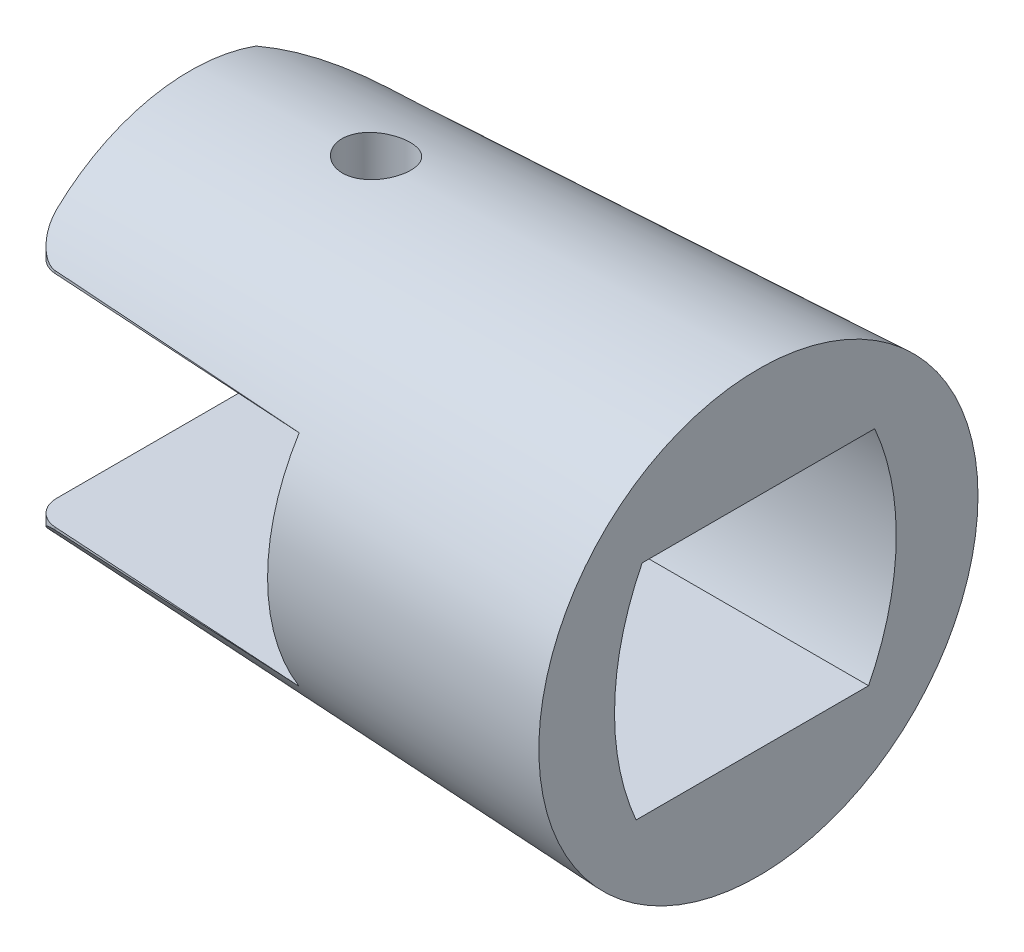
ISO-10303-21;
HEADER;
FILE_DESCRIPTION(('STEP AP214'),'2;1');
FILE_NAME('part.step','',(''),(''),'','','');
FILE_SCHEMA(('AUTOMOTIVE_DESIGN { 1 0 10303 214 1 1 1 1 }'));
ENDSEC;
DATA;
#1=APPLICATION_CONTEXT('core data for automotive mechanical design processes');
#2=APPLICATION_PROTOCOL_DEFINITION('international standard','automotive_design',2000,#1);
#3=PRODUCT_CONTEXT('',#1,'mechanical');
#4=PRODUCT('Part','Part','',(#3));
#5=PRODUCT_RELATED_PRODUCT_CATEGORY('part','',(#4));
#6=PRODUCT_DEFINITION_FORMATION('','',#4);
#7=PRODUCT_DEFINITION_CONTEXT('part definition',#1,'design');
#8=PRODUCT_DEFINITION('design','',#6,#7);
#9=PRODUCT_DEFINITION_SHAPE('','',#8);
#10=(LENGTH_UNIT() NAMED_UNIT(*) SI_UNIT(.MILLI.,.METRE.));
#11=(NAMED_UNIT(*) PLANE_ANGLE_UNIT() SI_UNIT($,.RADIAN.));
#12=(NAMED_UNIT(*) SI_UNIT($,.STERADIAN.) SOLID_ANGLE_UNIT());
#13=UNCERTAINTY_MEASURE_WITH_UNIT(LENGTH_MEASURE(1.E-05),#10,'distance_accuracy_value','');
#14=(GEOMETRIC_REPRESENTATION_CONTEXT(3) GLOBAL_UNCERTAINTY_ASSIGNED_CONTEXT((#13)) GLOBAL_UNIT_ASSIGNED_CONTEXT((#10,
#11,#12)) REPRESENTATION_CONTEXT('',''));
#15=CARTESIAN_POINT('',(0.,0.,0.));
#16=DIRECTION('',(0.,0.,1.));
#17=DIRECTION('',(1.,0.,0.));
#18=AXIS2_PLACEMENT_3D('',#15,#16,#17);
#19=CARTESIAN_POINT('',(-11.,0.,10.));
#20=DIRECTION('',(1.,0.,0.));
#21=DIRECTION('',(0.,0.,-1.));
#22=AXIS2_PLACEMENT_3D('',#19,#20,#21);
#23=PLANE('',#22);
#24=DIRECTION('',(0.,0.,-1.));
#25=VECTOR('',#24,1.);
#26=CARTESIAN_POINT('',(-11.,4.25,10.));
#27=LINE('',#26,#25);
#28=CARTESIAN_POINT('',(-11.,4.25,6.77772085586298));
#29=VERTEX_POINT('',#28);
#30=CARTESIAN_POINT('',(-11.,4.25,4.5));
#31=VERTEX_POINT('',#30);
#32=EDGE_CURVE('E247',#29,#31,#27,.T.);
#33=ORIENTED_EDGE('',*,*,#32,.T.);
#34=CARTESIAN_POINT('',(-11.,-0.249999999999947,-4.43028554974591));
#35=DIRECTION('',(1.,0.,0.));
#36=DIRECTION('',(0.,0.,-1.));
#37=AXIS2_PLACEMENT_3D('',#34,#35,#36);
#38=CIRCLE('',#37,10.);
#39=CARTESIAN_POINT('',(-11.,-4.25,4.73486584016575));
#40=VERTEX_POINT('',#39);
#41=EDGE_CURVE('E371',#31,#40,#38,.T.);
#42=ORIENTED_EDGE('',*,*,#41,.T.);
#43=DIRECTION('',(0.,0.,-1.));
#44=VECTOR('',#43,1.);
#45=CARTESIAN_POINT('',(-11.,-4.25,10.));
#46=LINE('',#45,#44);
#47=CARTESIAN_POINT('',(-11.,-4.25,6.77772085586298));
#48=VERTEX_POINT('',#47);
#49=EDGE_CURVE('E251',#48,#40,#46,.T.);
#50=ORIENTED_EDGE('',*,*,#49,.F.);
#51=CARTESIAN_POINT('',(-11.,0.,0.));
#52=DIRECTION('',(1.,0.,0.));
#53=DIRECTION('',(0.,0.,-1.));
#54=AXIS2_PLACEMENT_3D('',#51,#52,#53);
#55=CIRCLE('',#54,8.);
#56=EDGE_CURVE('E437',#48,#29,#55,.F.);
#57=ORIENTED_EDGE('',*,*,#56,.T.);
#58=EDGE_LOOP('',(#33,#42,#50,#57));
#59=FACE_BOUND('',#58,.T.);
#60=ADVANCED_FACE('F44',(#59),#23,.F.);
#61=CARTESIAN_POINT('',(-22.,0.,0.));
#62=DIRECTION('',(1.,0.,0.));
#63=DIRECTION('',(0.,0.,-1.));
#64=AXIS2_PLACEMENT_3D('',#61,#62,#63);
#65=CONICAL_SURFACE('',#64,7.5,0.0454232794215771);
#66=CARTESIAN_POINT('',(-16.1991105064426,7.64213239860376,-1.36838948473856));
#67=CARTESIAN_POINT('',(-16.1508958141531,7.63542076172434,-1.41830655928894));
#68=CARTESIAN_POINT('',(-16.0984640394933,7.62911627347668,-1.46425428633825));
#69=CARTESIAN_POINT('',(-15.9865616989317,7.61798266028014,-1.54688930956662));
#70=CARTESIAN_POINT('',(-15.9270857940176,7.6131546644773,-1.58356951471042));
#71=CARTESIAN_POINT('',(-15.802712395997,7.60556121739957,-1.64657757660265));
#72=CARTESIAN_POINT('',(-15.7378122849934,7.60279676852596,-1.6729003991531));
#73=CARTESIAN_POINT('',(-15.6044894198699,7.59976966951342,-1.71435496620886));
#74=CARTESIAN_POINT('',(-15.5360675880329,7.59950636768161,-1.72948962492742));
#75=CARTESIAN_POINT('',(-15.3986493193805,7.601678960494,-1.74800214952895));
#76=CARTESIAN_POINT('',(-15.3296735239488,7.60407800564145,-1.75153790545443));
#77=CARTESIAN_POINT('',(-15.1922197490342,7.61147677366023,-1.74724166449967));
#78=CARTESIAN_POINT('',(-15.1237417778008,7.61647653952937,-1.73940947966908));
#79=CARTESIAN_POINT('',(-14.9893122034088,7.62878729562398,-1.71270870352584));
#80=CARTESIAN_POINT('',(-14.9233566968642,7.63609453825562,-1.69385796559172));
#81=CARTESIAN_POINT('',(-14.7956032365479,7.65254635393307,-1.64575063446263));
#82=CARTESIAN_POINT('',(-14.7338057780463,7.66169114533623,-1.61649280426639));
#83=CARTESIAN_POINT('',(-14.6146164208518,7.68142115811766,-1.54765952743847));
#84=CARTESIAN_POINT('',(-14.5573538680598,7.69203400686407,-1.50786808141507));
#85=CARTESIAN_POINT('',(-14.4502759218419,7.71379780513905,-1.41939866566641));
#86=CARTESIAN_POINT('',(-14.4004616008841,7.72494883185447,-1.37071941842715));
#87=CARTESIAN_POINT('',(-14.308562494205,7.74727150917654,-1.26458252042323));
#88=CARTESIAN_POINT('',(-14.266672691938,7.75843817733606,-1.2069547552206));
#89=CARTESIAN_POINT('',(-14.1932084656516,7.7797615741078,-1.08528800075841));
#90=CARTESIAN_POINT('',(-14.1616339806865,7.78991830868673,-1.02124904938079));
#91=CARTESIAN_POINT('',(-14.1098588735166,7.80851391292312,-0.888725966160254));
#92=CARTESIAN_POINT('',(-14.0896222542327,7.81695816450501,-0.820256681647045));
#93=CARTESIAN_POINT('',(-14.061072971363,7.83165138460125,-0.680648621468626));
#94=CARTESIAN_POINT('',(-14.052758507449,7.83790068446094,-0.609510250519243));
#95=CARTESIAN_POINT('',(-14.0484522952261,7.84778514931267,-0.468304544460963));
#96=CARTESIAN_POINT('',(-14.0521855342659,7.85147635133582,-0.398249476364143));
#97=CARTESIAN_POINT('',(-14.071329170513,7.85640983357746,-0.259667810323408));
#98=CARTESIAN_POINT('',(-14.0867385243256,7.85765233257991,-0.191141076368558));
#99=CARTESIAN_POINT('',(-14.128492897101,7.85785284225483,-0.058605743907525));
#100=CARTESIAN_POINT('',(-14.1546754138614,7.85684385409155,0.00545411413245929));
#101=CARTESIAN_POINT('',(-14.2172061762014,7.8529554420828,0.128339672817716));
#102=CARTESIAN_POINT('',(-14.2535547688558,7.85007595437311,0.187165194669775));
#103=CARTESIAN_POINT('',(-14.33564939293,7.84290661884702,0.298331454790711));
#104=CARTESIAN_POINT('',(-14.3814541520736,7.83860785145139,0.35062822183059));
#105=CARTESIAN_POINT('',(-14.4810394588978,7.82917620282735,0.446889941699957));
#106=CARTESIAN_POINT('',(-14.5348206521234,7.82404325408415,0.490854219511729));
#107=CARTESIAN_POINT('',(-14.6496931312128,7.81345670361802,0.569825204161493));
#108=CARTESIAN_POINT('',(-14.7108758925215,7.80799962872127,0.604698457611458));
#109=CARTESIAN_POINT('',(-14.8382444432748,7.79739564393625,0.6637044897007));
#110=CARTESIAN_POINT('',(-14.9044303303778,7.79224874010588,0.687837058623818));
#111=CARTESIAN_POINT('',(-15.0402241368509,7.78270476049587,0.72473880536946));
#112=CARTESIAN_POINT('',(-15.1098440907648,7.77831060474813,0.737464507047952));
#113=CARTESIAN_POINT('',(-15.2502912846662,7.77060175559334,0.751001880492983));
#114=CARTESIAN_POINT('',(-15.3211184785031,7.767287021019,0.751814006675144));
#115=CARTESIAN_POINT('',(-15.4615301135133,7.76186641491048,0.741504998097269));
#116=CARTESIAN_POINT('',(-15.5311193880888,7.75975362099767,0.730453277969864));
#117=CARTESIAN_POINT('',(-15.6674801831399,7.75662221504508,0.696824735222845));
#118=CARTESIAN_POINT('',(-15.7342517323173,7.75560359185731,0.674248030029435));
#119=CARTESIAN_POINT('',(-15.8628851054713,7.75439899973845,0.618287283442594));
#120=CARTESIAN_POINT('',(-15.9247600998771,7.75421071707963,0.584933551104948));
#121=CARTESIAN_POINT('',(-16.0420578125317,7.75426433037923,0.508343495615129));
#122=CARTESIAN_POINT('',(-16.0974803849768,7.7545062360565,0.465106949208793));
#123=CARTESIAN_POINT('',(-16.2004511088615,7.75494768906834,0.369839556377424));
#124=CARTESIAN_POINT('',(-16.2479773370052,7.75514711889195,0.317785010074491));
#125=CARTESIAN_POINT('',(-16.33362259248,7.75501450579899,0.206439946900698));
#126=CARTESIAN_POINT('',(-16.3717416868938,7.75468246667248,0.147149481634012));
#127=CARTESIAN_POINT('',(-16.437483487879,7.75305536372848,0.0230317553152771));
#128=CARTESIAN_POINT('',(-16.4651077721284,7.7517604447467,-0.0417946717232883));
#129=CARTESIAN_POINT('',(-16.5090837599272,7.74789483036569,-0.175125147731818));
#130=CARTESIAN_POINT('',(-16.5254361602932,7.74532421384571,-0.243628969086713));
#131=CARTESIAN_POINT('',(-16.5463860889201,7.73877397471131,-0.38207858523554));
#132=CARTESIAN_POINT('',(-16.5510276678073,7.73479969655463,-0.452017975678318));
#133=CARTESIAN_POINT('',(-16.5485915654112,7.72548754817343,-0.59161330924282));
#134=CARTESIAN_POINT('',(-16.5415116273113,7.72014941552488,-0.661269195191051));
#135=CARTESIAN_POINT('',(-16.5158437856867,7.70833750676838,-0.798518169432213));
#136=CARTESIAN_POINT('',(-16.4972245671329,7.70186067486092,-0.866105117574989));
#137=CARTESIAN_POINT('',(-16.4490137309468,7.68820545400156,-0.997124780343338));
#138=CARTESIAN_POINT('',(-16.4194307611689,7.68102762125416,-1.06056072287359));
#139=CARTESIAN_POINT('',(-16.3591222362737,7.66840925157617,-1.16590935920253));
#140=CARTESIAN_POINT('',(-16.3306707233596,7.66299948879188,-1.20914558818589));
#141=CARTESIAN_POINT('',(-16.2686303426236,7.65236191060591,-1.29178587179423));
#142=CARTESIAN_POINT('',(-16.2350414332522,7.64713409667618,-1.33118989542148));
#143=CARTESIAN_POINT('',(-16.1991105064426,7.64213239860376,-1.36838948473856));
#144=B_SPLINE_CURVE_WITH_KNOTS('',3,(#66,#67,#68,#69,#70,#71,#72,#73,#74,#75,#76,#77,#78,#79,
#80,#81,#82,#83,#84,#85,#86,#87,#88,#89,#90,#91,#92,#93,#94,#95,#96,#97,#98,#99,#100,#101,#102,
#103,#104,#105,#106,#107,#108,#109,#110,#111,#112,#113,#114,#115,#116,#117,#118,#119,#120,#121,
#122,#123,#124,#125,#126,#127,#128,#129,#130,#131,#132,#133,#134,#135,#136,#137,#138,#139,#140,
#141,#142,#143),.UNSPECIFIED.,.T.,.F.,(4,2,2,2,2,2,2,2,2,2,2,2,2,2,2,2,2,2,2,2,2,2,2,2,2,2,2,2,
2,2,2,2,2,2,2,2,2,2,4),(0.,0.20898815908834,0.41813574427288,0.627384860280111,
0.836579453344756,1.04291430318027,1.24925256446439,1.45525741870395,1.66128676715023,
1.87192122846896,2.08258598981495,2.29790285538215,2.51321844877551,2.72784649621161,
2.94244212990628,3.15217414289225,3.36188741612846,3.56854703875268,3.77521371769965,
3.98320475141169,4.19121262735113,4.40212098182154,4.61303345418124,4.82474642188118,
5.03645131426148,5.24692425172714,5.45739504476097,5.66727899295867,5.87716768293301,
6.08762970444704,6.29809022510347,6.50851909483774,6.71893495490389,6.92855814100928,
7.13822169186476,7.3484567293843,7.55852629197703,7.71426880857834,7.87001258483612),.UNSPECIFIED.);
#145=CARTESIAN_POINT('',(-16.1991105064426,7.64213239860376,-1.36838948473856));
#146=VERTEX_POINT('',#145);
#147=EDGE_CURVE('E181',#146,#146,#144,.T.);
#148=ORIENTED_EDGE('',*,*,#147,.T.);
#149=EDGE_LOOP('',(#148));
#150=FACE_BOUND('',#149,.T.);
#151=CARTESIAN_POINT('',(-41.5118530495364,0.,4.90960169713127));
#152=DIRECTION('',(-0.0611115794993297,0.,0.998130940734279));
#153=DIRECTION('',(0.998130940734279,0.,0.0611115794993297));
#154=AXIS2_PLACEMENT_3D('',#151,#152,#153);
#155=ELLIPSE('',#154,108.213494771976,4.43044815934391);
#156=CARTESIAN_POINT('',(-21.0611115794994,-4.35030922266395,6.16171909191617));
#157=VERTEX_POINT('',#156);
#158=EDGE_CURVE('E412',#48,#157,#155,.F.);
#159=ORIENTED_EDGE('',*,*,#158,.T.);
#160=CARTESIAN_POINT('',(-21.0611115794993,-4.35030922266395,6.16171909191617));
#161=CARTESIAN_POINT('',(-21.0960747914109,-4.35051356340758,6.15962202294587));
#162=CARTESIAN_POINT('',(-21.1307813214346,-4.35346778045731,6.15561243833207));
#163=CARTESIAN_POINT('',(-21.1985190771024,-4.36415418241963,6.14426807244674));
#164=CARTESIAN_POINT('',(-21.2315642056245,-4.3718351604082,6.13696914977953));
#165=CARTESIAN_POINT('',(-21.3035295203859,-4.39369648239994,6.11731554569819));
#166=CARTESIAN_POINT('',(-21.3418761871241,-4.40901577852048,6.10415620522647));
#167=CARTESIAN_POINT('',(-21.4149283606298,-4.44443557078691,6.07430260660561));
#168=CARTESIAN_POINT('',(-21.4496163023613,-4.46455774127447,6.05759236262458));
#169=CARTESIAN_POINT('',(-21.531946468789,-4.51931086063731,6.01225519576181));
#170=CARTESIAN_POINT('',(-21.5771775571261,-4.55610872004904,5.98189606961668));
#171=CARTESIAN_POINT('',(-21.6598615980811,-4.6342222492668,5.91681901434334));
#172=CARTESIAN_POINT('',(-21.6972980555852,-4.67554722314516,5.88209208602675));
#173=CARTESIAN_POINT('',(-21.7830311966419,-4.78319627199736,5.79019145424798));
#174=CARTESIAN_POINT('',(-21.8267397409008,-4.85127319447803,5.73079069632704));
#175=CARTESIAN_POINT('',(-21.8996051814965,-4.98975683289049,5.60620400269983));
#176=CARTESIAN_POINT('',(-21.9287525468712,-5.06016504269773,5.54101431065619));
#177=CARTESIAN_POINT('',(-21.9669423984771,-5.18258484226127,5.42388394775105));
#178=CARTESIAN_POINT('',(-21.9792550755708,-5.2345697331447,5.37296218184321));
#179=CARTESIAN_POINT('',(-21.9957467088538,-5.33772131710358,5.26944127270405));
#180=CARTESIAN_POINT('',(-21.9999586548459,-5.38889048351514,5.2168498232289));
#181=CARTESIAN_POINT('',(-21.9999999999995,-5.43942713814805,5.16358716482823));
#182=B_SPLINE_CURVE_WITH_KNOTS('',3,(#160,#161,#162,#163,#164,#165,#166,#167,#168,#169,#170,
#171,#172,#173,#174,#175,#176,#177,#178,#179,#180,#181),.UNSPECIFIED.,.F.,.F.,(4,2,2,2,2,2,2,2,
2,2,4),(0.,0.104737956290573,0.20836074561613,0.337663511366164,0.467561208549421,
0.663680584398123,0.860210864778958,1.15972124568397,1.45942741390104,1.68039223758089,
1.90045527217779),.UNSPECIFIED.);
#183=CARTESIAN_POINT('',(-22.,-5.43942765765587,5.16358765802045));
#184=VERTEX_POINT('',#183);
#185=EDGE_CURVE('E302',#157,#184,#182,.T.);
#186=ORIENTED_EDGE('',*,*,#185,.T.);
#187=CARTESIAN_POINT('',(-22.,0.,0.));
#188=DIRECTION('',(1.,0.,0.));
#189=DIRECTION('',(0.,0.,-1.));
#190=AXIS2_PLACEMENT_3D('',#187,#188,#189);
#191=CIRCLE('',#190,7.5);
#192=CARTESIAN_POINT('',(-21.9999999999998,-7.05225000259581,-2.55260061523294));
#193=VERTEX_POINT('',#192);
#194=EDGE_CURVE('E266',#184,#193,#191,.T.);
#195=ORIENTED_EDGE('',*,*,#194,.T.);
#196=CARTESIAN_POINT('',(-16.5272227634073,-3.91896344353208,-6.684687530857));
#197=CARTESIAN_POINT('',(-16.6427127671059,-3.95329674635129,-6.65847955556438));
#198=CARTESIAN_POINT('',(-16.7566693164258,-3.99085174347405,-6.63004153669327));
#199=CARTESIAN_POINT('',(-16.9814370959532,-4.07124785328741,-6.56895905885342));
#200=CARTESIAN_POINT('',(-17.0922510678245,-4.11408417226116,-6.53631841332278));
#201=CARTESIAN_POINT('',(-17.3105332665758,-4.20381588665415,-6.46714088297935));
#202=CARTESIAN_POINT('',(-17.4180105859096,-4.25069863463741,-6.43061606093192));
#203=CARTESIAN_POINT('',(-17.6301048386284,-4.34772844122679,-6.35373913994798));
#204=CARTESIAN_POINT('',(-17.7347210411814,-4.39787632300832,-6.31338607468899));
#205=CARTESIAN_POINT('',(-18.0447644315248,-4.5521525011536,-6.18664455827059));
#206=CARTESIAN_POINT('',(-18.2460892693231,-4.65998636071397,-6.09466885439665));
#207=CARTESIAN_POINT('',(-18.6388142973702,-4.88064755111759,-5.89629879498852));
#208=CARTESIAN_POINT('',(-18.8302055665367,-4.99347920742176,-5.78989177859903));
#209=CARTESIAN_POINT('',(-19.2013077328751,-5.21918797308576,-5.56413300492337));
#210=CARTESIAN_POINT('',(-19.3811286353753,-5.33204927424095,-5.4449462930683));
#211=CARTESIAN_POINT('',(-19.7315405271321,-5.5563305825324,-5.19258525325173));
#212=CARTESIAN_POINT('',(-19.902133820893,-5.66775094419051,-5.05941444234583));
#213=CARTESIAN_POINT('',(-20.2334519196861,-5.88654777947444,-4.77921817415432));
#214=CARTESIAN_POINT('',(-20.3941996852896,-5.99393341697105,-4.63222714993483));
#215=CARTESIAN_POINT('',(-20.7055597270612,-6.20270444576696,-4.32401521420343));
#216=CARTESIAN_POINT('',(-20.8561739450322,-6.30409098616918,-4.16279704268034));
#217=CARTESIAN_POINT('',(-21.1878961239379,-6.52657567812968,-3.77774033897472));
#218=CARTESIAN_POINT('',(-21.3653992935145,-6.64501396174254,-3.54918276892559));
#219=CARTESIAN_POINT('',(-21.6995216755857,-6.86375180811079,-3.06823085541814));
#220=CARTESIAN_POINT('',(-21.8560787946518,-6.96399774059342,-2.81576926932262));
#221=CARTESIAN_POINT('',(-22.0003080623877,-7.0524389734962,-2.55203732001921));
#222=B_SPLINE_CURVE_WITH_KNOTS('',3,(#196,#197,#198,#199,#200,#201,#202,#203,#204,#205,#206,
#207,#208,#209,#210,#211,#212,#213,#214,#215,#216,#217,#218,#219,#220,#221),.UNSPECIFIED.,.F.,
.F.,(4,2,2,2,2,2,2,2,2,2,2,2,4),(0.,0.369742220096412,0.739151272096876,1.10744485071781,
1.47583164236118,2.21361214682884,2.95204415797171,3.68188313790468,4.41153899812975,
5.13942280519199,5.86716673466465,6.80312857828965,7.74180629803889),.UNSPECIFIED.);
#223=CARTESIAN_POINT('',(-17.4146827218211,-4.25,-6.43096361755301));
#224=VERTEX_POINT('',#223);
#225=EDGE_CURVE('E239',#224,#193,#222,.T.);
#226=ORIENTED_EDGE('',*,*,#225,.F.);
#227=CARTESIAN_POINT('',(-33.8126852718489,-4.25,-5.5155871153025));
#228=CARTESIAN_POINT('',(-31.3853699075223,-4.25,-5.65483903287506));
#229=CARTESIAN_POINT('',(-28.957947196194,-4.25,-5.79220398289213));
#230=CARTESIAN_POINT('',(-24.102926214611,-4.25,-6.06376035771553));
#231=CARTESIAN_POINT('',(-21.6753279445077,-4.25,-6.1979517852292));
#232=CARTESIAN_POINT('',(-16.8199914715129,-4.25,-6.46376172585246));
#233=CARTESIAN_POINT('',(-14.392253268658,-4.25,-6.59538023963274));
#234=CARTESIAN_POINT('',(-9.53665959490313,-4.25,-6.85645963504762));
#235=CARTESIAN_POINT('',(-7.10880412393918,-4.25,-6.98592051549281));
#236=CARTESIAN_POINT('',(-1.41358013309213,-4.25,-7.28746835630175));
#237=CARTESIAN_POINT('',(1.85382742252967,-4.25,-7.45881773024276));
#238=CARTESIAN_POINT('',(8.38878193375573,-4.25,-7.79884413360508));
#239=CARTESIAN_POINT('',(11.6563288893827,-4.25,-7.96752116258884));
#240=CARTESIAN_POINT('',(18.1915294937373,-4.25,-8.3026724390855));
#241=CARTESIAN_POINT('',(21.4591831422524,-4.25,-8.46914669074715));
#242=CARTESIAN_POINT('',(27.9945834199728,-4.25,-8.80023650372375));
#243=CARTESIAN_POINT('',(31.2623300491432,-4.25,-8.96485206572805));
#244=CARTESIAN_POINT('',(34.5301144470347,-4.25,-9.1287102280395));
#245=B_SPLINE_CURVE_WITH_KNOTS('',3,(#227,#228,#229,#230,#231,#232,#233,#234,#235,#236,#237,
#238,#239,#240,#241,#242,#243,#244),.UNSPECIFIED.,.F.,.F.,(4,2,2,2,2,2,2,2,4),(0.,
7.29391725989147,14.5878282970991,21.8817374329576,29.1756505895328,38.9913414305139,
48.8070338786212,58.6227078370245,68.438378154867),.UNSPECIFIED.);
#246=CARTESIAN_POINT('',(-11.,-4.25,-6.77772085586298));
#247=VERTEX_POINT('',#246);
#248=EDGE_CURVE('E321',#224,#247,#245,.T.);
#249=ORIENTED_EDGE('',*,*,#248,.T.);
#250=CARTESIAN_POINT('',(-11.,4.25,-6.77772085586298));
#251=VERTEX_POINT('',#250);
#252=EDGE_CURVE('E326',#251,#247,#55,.F.);
#253=ORIENTED_EDGE('',*,*,#252,.F.);
#254=CARTESIAN_POINT('',(-33.8126852718489,4.25,-5.5155871153025));
#255=CARTESIAN_POINT('',(-31.3853699075223,4.25,-5.65483903287507));
#256=CARTESIAN_POINT('',(-28.957947196194,4.25,-5.79220398289214));
#257=CARTESIAN_POINT('',(-24.102926214611,4.25,-6.06376035771554));
#258=CARTESIAN_POINT('',(-21.6753279445077,4.25,-6.19795178522921));
#259=CARTESIAN_POINT('',(-16.8199914715129,4.25,-6.46376172585246));
#260=CARTESIAN_POINT('',(-14.392253268658,4.25,-6.59538023963274));
#261=CARTESIAN_POINT('',(-9.53665959490313,4.25,-6.85645963504762));
#262=CARTESIAN_POINT('',(-7.10880412393918,4.25,-6.98592051549281));
#263=CARTESIAN_POINT('',(-1.41358013309214,4.25,-7.28746835630175));
#264=CARTESIAN_POINT('',(1.85382742252966,4.25,-7.45881773024276));
#265=CARTESIAN_POINT('',(8.38878193375571,4.25,-7.79884413360508));
#266=CARTESIAN_POINT('',(11.6563288893827,4.25,-7.96752116258884));
#267=CARTESIAN_POINT('',(18.1915294937373,4.25,-8.3026724390855));
#268=CARTESIAN_POINT('',(21.4591831422524,4.25,-8.46914669074715));
#269=CARTESIAN_POINT('',(27.9945834199728,4.25,-8.80023650372375));
#270=CARTESIAN_POINT('',(31.2623300491432,4.25,-8.96485206572805));
#271=CARTESIAN_POINT('',(34.5301144470347,4.25,-9.1287102280395));
#272=B_SPLINE_CURVE_WITH_KNOTS('',3,(#254,#255,#256,#257,#258,#259,#260,#261,#262,#263,#264,
#265,#266,#267,#268,#269,#270,#271),.UNSPECIFIED.,.F.,.F.,(4,2,2,2,2,2,2,2,4),(0.,
7.29391725989147,14.5878282970991,21.8817374329576,29.1756505895328,38.9913414305139,
48.8070338786212,58.6227078370245,68.438378154867),.UNSPECIFIED.);
#273=CARTESIAN_POINT('',(-17.4146827218211,4.25,-6.43096361755301));
#274=VERTEX_POINT('',#273);
#275=EDGE_CURVE('E436',#251,#274,#272,.F.);
#276=ORIENTED_EDGE('',*,*,#275,.T.);
#277=CARTESIAN_POINT('',(-22.0003080623877,7.0524389734962,-2.55203732001921));
#278=CARTESIAN_POINT('',(-21.8865501625451,6.98266926908595,-2.76006889586726));
#279=CARTESIAN_POINT('',(-21.7650667699985,6.90553513148157,-2.96115407159308));
#280=CARTESIAN_POINT('',(-21.508493529345,6.73917648584937,-3.34864268637224));
#281=CARTESIAN_POINT('',(-21.3734265500854,6.64997221400663,-3.53506989034863));
#282=CARTESIAN_POINT('',(-21.0914944642558,6.4620983081212,-3.8926999624019));
#283=CARTESIAN_POINT('',(-20.9446595735615,6.36345279678775,-4.0639395844802));
#284=CARTESIAN_POINT('',(-20.6400538581137,6.15879267743817,-4.39176817948242));
#285=CARTESIAN_POINT('',(-20.4822783291448,6.05277489946614,-4.54835078138103));
#286=CARTESIAN_POINT('',(-20.1578370784349,5.83643149189731,-4.84588988896659));
#287=CARTESIAN_POINT('',(-19.9912387897799,5.72613989346029,-4.98694502527183));
#288=CARTESIAN_POINT('',(-19.6486850111953,5.50289121690271,-5.25481733215771));
#289=CARTESIAN_POINT('',(-19.4727300721882,5.38993429593453,-5.38163533965996));
#290=CARTESIAN_POINT('',(-19.1117869780169,5.16405221946017,-5.62103306771884));
#291=CARTESIAN_POINT('',(-18.9268105416526,5.05112720480102,-5.73363061176831));
#292=CARTESIAN_POINT('',(-18.5472878152095,4.82822203601791,-5.94478562930339));
#293=CARTESIAN_POINT('',(-18.3527425637343,4.71824156428428,-6.04334462203561));
#294=CARTESIAN_POINT('',(-18.0265884245266,4.54434936735566,-6.19261987574077));
#295=CARTESIAN_POINT('',(-17.8980562277181,4.47833109034495,-6.24762842784334));
#296=CARTESIAN_POINT('',(-17.6366586028298,4.35049937851545,-6.3517121623919));
#297=CARTESIAN_POINT('',(-17.5037958087032,4.28868345582808,-6.40079086902872));
#298=CARTESIAN_POINT('',(-17.2332414308166,4.17077976931123,-6.49285379079453));
#299=CARTESIAN_POINT('',(-17.0955443981608,4.11469876746748,-6.53583083417332));
#300=CARTESIAN_POINT('',(-16.8151295178568,4.01037735782446,-6.61527669848076));
#301=CARTESIAN_POINT('',(-16.6724037043015,3.96215013893154,-6.65173458160315));
#302=CARTESIAN_POINT('',(-16.5272227634072,3.91896344353208,-6.68468753085701));
#303=B_SPLINE_CURVE_WITH_KNOTS('',3,(#277,#278,#279,#280,#281,#282,#283,#284,#285,#286,#287,
#288,#289,#290,#291,#292,#293,#294,#295,#296,#297,#298,#299,#300,#301,#302),.UNSPECIFIED.,.F.,
.F.,(4,2,2,2,2,2,2,2,2,2,2,2,4),(0.,0.740833951218997,1.48044090115842,2.21820616396747,
2.95629063927878,3.68937726721113,4.42242077846857,5.15453619976111,5.88657233151188,
6.35021514569359,6.81358104068867,7.27748713433333,7.74216440921874),.UNSPECIFIED.);
#304=CARTESIAN_POINT('',(-21.9999999999999,7.05225000259585,-2.55260061523282));
#305=VERTEX_POINT('',#304);
#306=EDGE_CURVE('E408',#305,#274,#303,.T.);
#307=ORIENTED_EDGE('',*,*,#306,.F.);
#308=CARTESIAN_POINT('',(-22.,5.43942732783755,5.16358776971788));
#309=VERTEX_POINT('',#308);
#310=EDGE_CURVE('E49',#305,#309,#191,.T.);
#311=ORIENTED_EDGE('',*,*,#310,.T.);
#312=CARTESIAN_POINT('',(-21.9999999999997,5.43942692599864,5.16358738831069));
#313=CARTESIAN_POINT('',(-21.999988013143,5.40184320556245,5.20318749921114));
#314=CARTESIAN_POINT('',(-21.9976480658442,5.36390633417556,5.24243191883521));
#315=CARTESIAN_POINT('',(-21.9884703459431,5.2875949713991,5.3199754661269));
#316=CARTESIAN_POINT('',(-21.9816316889269,5.24922039541796,5.35827440638373));
#317=CARTESIAN_POINT('',(-21.9635351279353,5.17197734108679,5.43401065216798));
#318=CARTESIAN_POINT('',(-21.952238686453,5.13310749569211,5.47143734588329));
#319=CARTESIAN_POINT('',(-21.9252941853482,5.05553834603688,5.54484730589776));
#320=CARTESIAN_POINT('',(-21.9096469965899,5.01683900921972,5.58083085941441));
#321=CARTESIAN_POINT('',(-21.8632877834427,4.91690464192796,5.67223267566103));
#322=CARTESIAN_POINT('',(-21.8291655895984,4.85605246576613,5.7263849970058));
#323=CARTESIAN_POINT('',(-21.7490883355968,4.73783831693094,5.82925153926951));
#324=CARTESIAN_POINT('',(-21.7031758270755,4.68046469182239,5.87798443108639));
#325=CARTESIAN_POINT('',(-21.6195957077943,4.59501073033797,5.94955989537241));
#326=CARTESIAN_POINT('',(-21.5863438669347,4.56461212732682,5.97478784894987));
#327=CARTESIAN_POINT('',(-21.514689351926,4.50752819548121,6.02203687691116));
#328=CARTESIAN_POINT('',(-21.4762913016731,4.4808395765597,6.0440607935155));
#329=CARTESIAN_POINT('',(-21.4033826848435,4.43849136775602,6.07930060925859));
#330=CARTESIAN_POINT('',(-21.3699558302646,4.42170244710058,6.09338213602483));
#331=CARTESIAN_POINT('',(-21.3000779214319,4.39272075778112,6.118218433634));
#332=CARTESIAN_POINT('',(-21.2636378052955,4.38051218532723,6.12898462006588));
#333=CARTESIAN_POINT('',(-21.1994895435668,4.36464569516296,6.14386507669782));
#334=CARTESIAN_POINT('',(-21.1723796392173,4.35952747256111,6.14900480397172));
#335=CARTESIAN_POINT('',(-21.1172658201509,4.35244450096266,6.15708677223797));
#336=CARTESIAN_POINT('',(-21.0892574866906,4.3504990307251,6.16001552124293));
#337=CARTESIAN_POINT('',(-21.0611115794994,4.35030922266381,6.16171909191617));
#338=B_SPLINE_CURVE_WITH_KNOTS('',3,(#312,#313,#314,#315,#316,#317,#318,#319,#320,#321,#322,
#323,#324,#325,#326,#327,#328,#329,#330,#331,#332,#333,#334,#335,#336,#337),.UNSPECIFIED.,.F.,
.F.,(4,2,2,2,2,2,2,2,2,2,2,2,4),(0.,0.16371410731572,0.327460409265002,0.492654448520601,
0.657815445605374,0.921882738986487,1.18501008005081,1.33955753350556,1.49396704473969,
1.61346780524258,1.73255236957522,1.8164792910756,1.90091430726266),.UNSPECIFIED.);
#339=CARTESIAN_POINT('',(-21.0611115794993,4.35030922266395,6.16171909191617));
#340=VERTEX_POINT('',#339);
#341=EDGE_CURVE('E363',#309,#340,#338,.T.);
#342=ORIENTED_EDGE('',*,*,#341,.T.);
#343=EDGE_CURVE('E315',#340,#29,#155,.F.);
#344=ORIENTED_EDGE('',*,*,#343,.T.);
#345=ORIENTED_EDGE('',*,*,#56,.F.);
#346=EDGE_LOOP('',(#159,#186,#195,#226,#249,#253,#276,#307,#311,#342,#344,#345));
#347=FACE_BOUND('',#346,.T.);
#348=CARTESIAN_POINT('',(0.,0.,0.));
#349=DIRECTION('',(1.,0.,0.));
#350=DIRECTION('',(0.,0.,-1.));
#351=AXIS2_PLACEMENT_3D('',#348,#349,#350);
#352=CIRCLE('',#351,8.5);
#353=CARTESIAN_POINT('',(0.,0.,-8.5));
#354=VERTEX_POINT('',#353);
#355=EDGE_CURVE('E277',#354,#354,#352,.T.);
#356=ORIENTED_EDGE('',*,*,#355,.F.);
#357=EDGE_LOOP('',(#356));
#358=FACE_BOUND('',#357,.T.);
#359=CARTESIAN_POINT('',(-16.1991105064426,-7.64213239860376,-1.36838948473856));
#360=CARTESIAN_POINT('',(-16.2481183827204,-7.64895517152965,-1.31764401423421));
#361=CARTESIAN_POINT('',(-16.2928225988122,-7.65620590986641,-1.2627403660346));
#362=CARTESIAN_POINT('',(-16.37236519701,-7.67086859718286,-1.14615969551993));
#363=CARTESIAN_POINT('',(-16.4071930934637,-7.67828070857147,-1.0844755700633));
#364=CARTESIAN_POINT('',(-16.4659627346481,-7.6926297415254,-0.956083213808689));
#365=CARTESIAN_POINT('',(-16.4899073685247,-7.69956678878873,-0.889376321876583));
#366=CARTESIAN_POINT('',(-16.526205490571,-7.71245877414565,-0.752806403240237));
#367=CARTESIAN_POINT('',(-16.5385621313391,-7.71841397899307,-0.682944240375051));
#368=CARTESIAN_POINT('',(-16.5512688819341,-7.72898635674714,-0.542314737588601));
#369=CARTESIAN_POINT('',(-16.5516663271452,-7.73360873306219,-0.47155207567303));
#370=CARTESIAN_POINT('',(-16.5405157515085,-7.74141012691772,-0.330891636510256));
#371=CARTESIAN_POINT('',(-16.5289678410068,-7.7445891577908,-0.260993851279729));
#372=CARTESIAN_POINT('',(-16.4943843307592,-7.74954946577903,-0.124706035435113));
#373=CARTESIAN_POINT('',(-16.4714505175338,-7.75134277405434,-0.0582905883346276));
#374=CARTESIAN_POINT('',(-16.4147865909779,-7.75382400633057,0.0697844754463724));
#375=CARTESIAN_POINT('',(-16.3810564620315,-7.75451192873267,0.131444085247932));
#376=CARTESIAN_POINT('',(-16.3037673891173,-7.7551677009176,0.248233235743787));
#377=CARTESIAN_POINT('',(-16.2602116731153,-7.75513578684572,0.303364911987125));
#378=CARTESIAN_POINT('',(-16.1644935955388,-7.7548204006079,0.40556770299564));
#379=CARTESIAN_POINT('',(-16.1123310658582,-7.75453692352801,0.452638660284246));
#380=CARTESIAN_POINT('',(-16.0006669817598,-7.75420336587905,0.537546499284532));
#381=CARTESIAN_POINT('',(-15.9411398196981,-7.75415412458617,0.57534971632979));
#382=CARTESIAN_POINT('',(-15.8165874117901,-7.75473204121915,0.64042727097625));
#383=CARTESIAN_POINT('',(-15.7515622523834,-7.75535918851265,0.667701774072472));
#384=CARTESIAN_POINT('',(-15.6179450146916,-7.7576159419089,0.710923579362009));
#385=CARTESIAN_POINT('',(-15.5493569212995,-7.7592444492561,0.726883255630492));
#386=CARTESIAN_POINT('',(-15.4105138744871,-7.76366635977606,0.747079761543385));
#387=CARTESIAN_POINT('',(-15.3402589487757,-7.76645974359696,0.751316785924929));
#388=CARTESIAN_POINT('',(-15.200235688324,-7.77317632835658,0.747974940222434));
#389=CARTESIAN_POINT('',(-15.1304666402132,-7.77709713627154,0.740420948430935));
#390=CARTESIAN_POINT('',(-14.9932240242938,-7.78585111175639,0.713785525557175));
#391=CARTESIAN_POINT('',(-14.9257505404352,-7.79068431265075,0.694703673372336));
#392=CARTESIAN_POINT('',(-14.7946866470933,-7.8008962267867,0.645460711922345));
#393=CARTESIAN_POINT('',(-14.7311141966589,-7.80627719797367,0.615252279842094));
#394=CARTESIAN_POINT('',(-14.6099253001897,-7.81704451765887,0.544613098263318));
#395=CARTESIAN_POINT('',(-14.5523091229652,-7.82243086638872,0.504181887687756));
#396=CARTESIAN_POINT('',(-14.4443738043172,-7.83263588662694,0.413987675921974));
#397=CARTESIAN_POINT('',(-14.3940910944341,-7.83745170300577,0.364180724484842));
#398=CARTESIAN_POINT('',(-14.3025956584595,-7.84586659319037,0.256744530870512));
#399=CARTESIAN_POINT('',(-14.2613825380846,-7.8494657198931,0.199115628914228));
#400=CARTESIAN_POINT('',(-14.189483896508,-7.85486692463116,0.078078620699237));
#401=CARTESIAN_POINT('',(-14.1587287890357,-7.85668103938802,0.0147124147773366));
#402=CARTESIAN_POINT('',(-14.1082781368869,-7.85812665344954,-0.11630086289614));
#403=CARTESIAN_POINT('',(-14.088581401632,-7.85775838776536,-0.183947472933266));
#404=CARTESIAN_POINT('',(-14.0610141622421,-7.85461726443622,-0.320553717132363));
#405=CARTESIAN_POINT('',(-14.0529801237809,-7.8518785348391,-0.389481188414362));
#406=CARTESIAN_POINT('',(-14.0483960968981,-7.84401865521448,-0.527577811926687));
#407=CARTESIAN_POINT('',(-14.051845848791,-7.83889755906222,-0.596746958656619));
#408=CARTESIAN_POINT('',(-14.0700294102141,-7.82647813621979,-0.733249679113928));
#409=CARTESIAN_POINT('',(-14.0847427666735,-7.81918377051993,-0.800586351096398));
#410=CARTESIAN_POINT('',(-14.1249226577547,-7.80280320625325,-0.931739134682005));
#411=CARTESIAN_POINT('',(-14.150390270654,-7.79371682805867,-0.995554892534385));
#412=CARTESIAN_POINT('',(-14.2118776098388,-7.77411763275919,-1.11914531449365));
#413=CARTESIAN_POINT('',(-14.2480832646701,-7.7635816009524,-1.17882375639454));
#414=CARTESIAN_POINT('',(-14.3298371577788,-7.74190517918116,-1.29127630226849));
#415=CARTESIAN_POINT('',(-14.3753867474308,-7.73076470196987,-1.34404940574071));
#416=CARTESIAN_POINT('',(-14.4756640587273,-7.70840174580074,-1.442337664681));
#417=CARTESIAN_POINT('',(-14.5305627811624,-7.69718237067437,-1.48767927970149));
#418=CARTESIAN_POINT('',(-14.6473838007255,-7.67570718163399,-1.56847345685151));
#419=CARTESIAN_POINT('',(-14.7093061531226,-7.66545137530348,-1.60392594115566));
#420=CARTESIAN_POINT('',(-14.8383565772616,-7.64667590262604,-1.6638011806514));
#421=CARTESIAN_POINT('',(-14.9054729602838,-7.63815248603518,-1.68824790346038));
#422=CARTESIAN_POINT('',(-15.0431225363433,-7.62343282087657,-1.72539502248808));
#423=CARTESIAN_POINT('',(-15.113655024855,-7.61723609474822,-1.73809782996621));
#424=CARTESIAN_POINT('',(-15.2542572570359,-7.60769797731069,-1.75110654954651));
#425=CARTESIAN_POINT('',(-15.3242945387061,-7.60428911895962,-1.75171424436526));
#426=CARTESIAN_POINT('',(-15.4635778143712,-7.60020475421617,-1.74121655666613));
#427=CARTESIAN_POINT('',(-15.5328237473572,-7.59952945716798,-1.73011027713968));
#428=CARTESIAN_POINT('',(-15.6672534150568,-7.60077360174533,-1.69680315811014));
#429=CARTESIAN_POINT('',(-15.7324873663926,-7.60264731246227,-1.67480224150436));
#430=CARTESIAN_POINT('',(-15.858341565984,-7.60856426721052,-1.62046637821591));
#431=CARTESIAN_POINT('',(-15.9189658030527,-7.61260561061213,-1.58814049472842));
#432=CARTESIAN_POINT('',(-16.0169814216477,-7.62090171994123,-1.52506769203603));
#433=CARTESIAN_POINT('',(-16.0559465434951,-7.6247409737931,-1.49667389314991));
#434=CARTESIAN_POINT('',(-16.1303109843434,-7.63303134897249,-1.43562708117636));
#435=CARTESIAN_POINT('',(-16.1657102304849,-7.63748248279777,-1.40297398109262));
#436=CARTESIAN_POINT('',(-16.1991105064426,-7.64213239860376,-1.36838948473856));
#437=B_SPLINE_CURVE_WITH_KNOTS('',3,(#359,#360,#361,#362,#363,#364,#365,#366,#367,#368,#369,
#370,#371,#372,#373,#374,#375,#376,#377,#378,#379,#380,#381,#382,#383,#384,#385,#386,#387,#388,
#389,#390,#391,#392,#393,#394,#395,#396,#397,#398,#399,#400,#401,#402,#403,#404,#405,#406,#407,
#408,#409,#410,#411,#412,#413,#414,#415,#416,#417,#418,#419,#420,#421,#422,#423,#424,#425,#426,
#427,#428,#429,#430,#431,#432,#433,#434,#435,#436),.UNSPECIFIED.,.T.,.F.,(4,2,2,2,2,2,2,2,2,2,2,
2,2,2,2,2,2,2,2,2,2,2,2,2,2,2,2,2,2,2,2,2,2,2,2,2,2,2,4),(0.,0.212452932617321,
0.425130588384251,0.637751752251184,0.850315054179576,1.06203690363306,1.2737567973081,
1.48361716733384,1.69347784090088,1.90326966982008,2.11306559682654,2.323612667683,
2.53415642893193,2.7444695794923,2.95477923630174,3.16464575260754,3.3745199356158,
3.58529724737798,3.7960840675062,4.00788476645479,4.21967625594225,4.43002959694479,
4.64036028631152,4.84771224142366,5.05505950767184,5.26203115186902,5.46902355304614,
5.67983305385892,5.89067306470267,6.1058928232882,6.32111427556009,6.5358647383239,
6.75057109874774,6.95991345855957,7.16927185012315,7.37492332792415,7.58039477990069,
7.72518460065953,7.86997737921667),.UNSPECIFIED.);
#438=CARTESIAN_POINT('',(-16.1991105064426,-7.64213239860376,-1.36838948473856));
#439=VERTEX_POINT('',#438);
#440=EDGE_CURVE('E189',#439,#439,#437,.T.);
#441=ORIENTED_EDGE('',*,*,#440,.T.);
#442=EDGE_LOOP('',(#441));
#443=FACE_BOUND('',#442,.T.);
#444=ADVANCED_FACE('F194',(#150,#347,#358,#443),#65,.T.);
#445=CARTESIAN_POINT('',(-22.,0.,0.));
#446=DIRECTION('',(1.,0.,0.));
#447=DIRECTION('',(0.,0.,-1.));
#448=AXIS2_PLACEMENT_3D('',#445,#446,#447);
#449=PLANE('',#448);
#450=ORIENTED_EDGE('',*,*,#194,.F.);
#451=DIRECTION('',(0.,-1.,0.));
#452=VECTOR('',#451,1.);
#453=CARTESIAN_POINT('',(-22.,-4.25,5.16358815118189));
#454=LINE('',#453,#452);
#455=CARTESIAN_POINT('',(-22.,-4.25,5.16358815118189));
#456=VERTEX_POINT('',#455);
#457=EDGE_CURVE('E304',#184,#456,#454,.F.);
#458=ORIENTED_EDGE('',*,*,#457,.T.);
#459=DIRECTION('',(0.,0.,1.));
#460=VECTOR('',#459,1.);
#461=CARTESIAN_POINT('',(-22.,-4.25,0.));
#462=LINE('',#461,#460);
#463=CARTESIAN_POINT('',(-22.,-4.25,-2.55260061523257));
#464=VERTEX_POINT('',#463);
#465=EDGE_CURVE('E261',#464,#456,#462,.T.);
#466=ORIENTED_EDGE('',*,*,#465,.F.);
#467=DIRECTION('',(0.,-1.,0.));
#468=VECTOR('',#467,1.);
#469=CARTESIAN_POINT('',(-22.,10.,-2.55260061523257));
#470=LINE('',#469,#468);
#471=EDGE_CURVE('E241',#464,#193,#470,.T.);
#472=ORIENTED_EDGE('',*,*,#471,.T.);
#473=EDGE_LOOP('',(#450,#458,#466,#472));
#474=FACE_BOUND('',#473,.T.);
#475=ADVANCED_FACE('F391',(#474),#449,.F.);
#476=DIRECTION('',(0.,0.,-1.));
#477=VECTOR('',#476,1.);
#478=CARTESIAN_POINT('',(-22.,4.25,0.));
#479=LINE('',#478,#477);
#480=CARTESIAN_POINT('',(-22.,4.25,5.16358815118189));
#481=VERTEX_POINT('',#480);
#482=CARTESIAN_POINT('',(-22.,4.25,-2.55260061523257));
#483=VERTEX_POINT('',#482);
#484=EDGE_CURVE('E253',#481,#483,#479,.T.);
#485=ORIENTED_EDGE('',*,*,#484,.F.);
#486=DIRECTION('',(0.,-1.,0.));
#487=VECTOR('',#486,1.);
#488=CARTESIAN_POINT('',(-22.,4.35755840113422,5.16358815118189));
#489=LINE('',#488,#487);
#490=EDGE_CURVE('E12',#481,#309,#489,.F.);
#491=ORIENTED_EDGE('',*,*,#490,.T.);
#492=ORIENTED_EDGE('',*,*,#310,.F.);
#493=DIRECTION('',(0.,-1.,0.));
#494=VECTOR('',#493,1.);
#495=CARTESIAN_POINT('',(-22.,10.,-2.55260061523257));
#496=LINE('',#495,#494);
#497=EDGE_CURVE('E406',#305,#483,#496,.T.);
#498=ORIENTED_EDGE('',*,*,#497,.T.);
#499=EDGE_LOOP('',(#485,#491,#492,#498));
#500=FACE_BOUND('',#499,.T.);
#501=ADVANCED_FACE('F385',(#500),#449,.F.);
#502=CARTESIAN_POINT('',(0.,-4.25,10.));
#503=DIRECTION('',(0.,1.,0.));
#504=DIRECTION('',(0.,0.,1.));
#505=AXIS2_PLACEMENT_3D('',#502,#503,#504);
#506=PLANE('',#505);
#507=ORIENTED_EDGE('',*,*,#465,.T.);
#508=CARTESIAN_POINT('',(-21.,-4.25,5.16358815118189));
#509=DIRECTION('',(0.,1.,0.));
#510=DIRECTION('',(0.,0.,1.));
#511=AXIS2_PLACEMENT_3D('',#508,#509,#510);
#512=CIRCLE('',#511,1.);
#513=CARTESIAN_POINT('',(-21.0611115794993,-4.25,6.16171909191617));
#514=VERTEX_POINT('',#513);
#515=EDGE_CURVE('E306',#456,#514,#512,.T.);
#516=ORIENTED_EDGE('',*,*,#515,.T.);
#517=DIRECTION('',(0.998130940734279,0.,0.0611115794993297));
#518=VECTOR('',#517,1.);
#519=CARTESIAN_POINT('',(0.155469638973756,-4.25,7.46072580228112));
#520=LINE('',#519,#518);
#521=EDGE_CURVE('E415',#514,#48,#520,.T.);
#522=ORIENTED_EDGE('',*,*,#521,.T.);
#523=ORIENTED_EDGE('',*,*,#49,.T.);
#524=DIRECTION('',(1.,0.,0.));
#525=VECTOR('',#524,1.);
#526=CARTESIAN_POINT('',(-12.,-4.25,4.73486584016575));
#527=LINE('',#526,#525);
#528=CARTESIAN_POINT('',(0.,-4.25,4.73486584016575));
#529=VERTEX_POINT('',#528);
#530=EDGE_CURVE('E152',#40,#529,#527,.T.);
#531=ORIENTED_EDGE('',*,*,#530,.T.);
#532=DIRECTION('',(0.,0.,-1.));
#533=VECTOR('',#532,1.);
#534=CARTESIAN_POINT('',(0.,-4.25,4.73486584016575));
#535=LINE('',#534,#533);
#536=CARTESIAN_POINT('',(0.,-4.25,-4.26513415983425));
#537=VERTEX_POINT('',#536);
#538=EDGE_CURVE('E156',#529,#537,#535,.T.);
#539=ORIENTED_EDGE('',*,*,#538,.T.);
#540=DIRECTION('',(1.,0.,0.));
#541=VECTOR('',#540,1.);
#542=CARTESIAN_POINT('',(-12.,-4.25,-4.26513415983425));
#543=LINE('',#542,#541);
#544=CARTESIAN_POINT('',(-11.,-4.25,-4.26513415983425));
#545=VERTEX_POINT('',#544);
#546=EDGE_CURVE('E141',#545,#537,#543,.T.);
#547=ORIENTED_EDGE('',*,*,#546,.F.);
#548=EDGE_CURVE('E250',#545,#247,#46,.T.);
#549=ORIENTED_EDGE('',*,*,#548,.T.);
#550=ORIENTED_EDGE('',*,*,#248,.F.);
#551=CARTESIAN_POINT('',(-14.6814586367819,-4.25,1.4502266329841));
#552=DIRECTION('',(0.,1.,0.));
#553=DIRECTION('',(0.,0.,1.));
#554=AXIS2_PLACEMENT_3D('',#551,#552,#553);
#555=CIRCLE('',#554,8.34168290359922);
#556=EDGE_CURVE('E405',#464,#224,#555,.F.);
#557=ORIENTED_EDGE('',*,*,#556,.F.);
#558=EDGE_LOOP('',(#507,#516,#522,#523,#531,#539,#547,#549,#550,#557));
#559=FACE_BOUND('',#558,.T.);
#560=CARTESIAN_POINT('',(-15.3,-4.25,-0.5));
#561=DIRECTION('',(0.,1.,0.));
#562=DIRECTION('',(0.,0.,1.));
#563=AXIS2_PLACEMENT_3D('',#560,#561,#562);
#564=CIRCLE('',#563,1.25);
#565=CARTESIAN_POINT('',(-15.3,-4.25,0.749999999999999));
#566=VERTEX_POINT('',#565);
#567=EDGE_CURVE('E178',#566,#566,#564,.F.);
#568=ORIENTED_EDGE('',*,*,#567,.T.);
#569=EDGE_LOOP('',(#568));
#570=FACE_BOUND('',#569,.T.);
#571=ADVANCED_FACE('F158',(#559,#570),#506,.T.);
#572=CARTESIAN_POINT('',(0.,4.25,10.));
#573=DIRECTION('',(0.,-1.,0.));
#574=DIRECTION('',(1.,0.,0.));
#575=AXIS2_PLACEMENT_3D('',#572,#573,#574);
#576=PLANE('',#575);
#577=DIRECTION('',(-0.998130940734279,0.,-0.0611115794993297));
#578=VECTOR('',#577,1.);
#579=CARTESIAN_POINT('',(0.155469638973756,4.25,7.46072580228112));
#580=LINE('',#579,#578);
#581=CARTESIAN_POINT('',(-21.0611115794993,4.25,6.16171909191617));
#582=VERTEX_POINT('',#581);
#583=EDGE_CURVE('E313',#29,#582,#580,.T.);
#584=ORIENTED_EDGE('',*,*,#583,.T.);
#585=CARTESIAN_POINT('',(-21.,4.25,5.16358815118189));
#586=DIRECTION('',(0.,-1.,0.));
#587=DIRECTION('',(1.,0.,0.));
#588=AXIS2_PLACEMENT_3D('',#585,#586,#587);
#589=CIRCLE('',#588,1.);
#590=EDGE_CURVE('E55',#582,#481,#589,.T.);
#591=ORIENTED_EDGE('',*,*,#590,.T.);
#592=ORIENTED_EDGE('',*,*,#484,.T.);
#593=CARTESIAN_POINT('',(-14.6814586367819,4.25,1.4502266329841));
#594=DIRECTION('',(0.,-1.,0.));
#595=DIRECTION('',(1.,0.,0.));
#596=AXIS2_PLACEMENT_3D('',#593,#594,#595);
#597=CIRCLE('',#596,8.34168290359922);
#598=EDGE_CURVE('E320',#274,#483,#597,.F.);
#599=ORIENTED_EDGE('',*,*,#598,.F.);
#600=ORIENTED_EDGE('',*,*,#275,.F.);
#601=CARTESIAN_POINT('',(-11.,4.25,-4.5));
#602=VERTEX_POINT('',#601);
#603=EDGE_CURVE('E244',#602,#251,#27,.T.);
#604=ORIENTED_EDGE('',*,*,#603,.F.);
#605=DIRECTION('',(1.,0.,0.));
#606=VECTOR('',#605,1.);
#607=CARTESIAN_POINT('',(-12.,4.25,-4.5));
#608=LINE('',#607,#606);
#609=CARTESIAN_POINT('',(0.,4.25,-4.5));
#610=VERTEX_POINT('',#609);
#611=EDGE_CURVE('E151',#602,#610,#608,.T.);
#612=ORIENTED_EDGE('',*,*,#611,.T.);
#613=DIRECTION('',(0.,0.,1.));
#614=VECTOR('',#613,1.);
#615=CARTESIAN_POINT('',(0.,4.25,4.5));
#616=LINE('',#615,#614);
#617=CARTESIAN_POINT('',(0.,4.25,4.5));
#618=VERTEX_POINT('',#617);
#619=EDGE_CURVE('E168',#610,#618,#616,.T.);
#620=ORIENTED_EDGE('',*,*,#619,.T.);
#621=DIRECTION('',(1.,0.,0.));
#622=VECTOR('',#621,1.);
#623=CARTESIAN_POINT('',(-12.,4.25,4.5));
#624=LINE('',#623,#622);
#625=EDGE_CURVE('E173',#31,#618,#624,.T.);
#626=ORIENTED_EDGE('',*,*,#625,.F.);
#627=ORIENTED_EDGE('',*,*,#32,.F.);
#628=EDGE_LOOP('',(#584,#591,#592,#599,#600,#604,#612,#620,#626,#627));
#629=FACE_BOUND('',#628,.T.);
#630=CARTESIAN_POINT('',(-15.3,4.25,-0.5));
#631=DIRECTION('',(0.,-1.,0.));
#632=DIRECTION('',(1.,0.,0.));
#633=AXIS2_PLACEMENT_3D('',#630,#631,#632);
#634=CIRCLE('',#633,1.25);
#635=CARTESIAN_POINT('',(-14.05,4.25,-0.5));
#636=VERTEX_POINT('',#635);
#637=EDGE_CURVE('E175',#636,#636,#634,.F.);
#638=ORIENTED_EDGE('',*,*,#637,.T.);
#639=EDGE_LOOP('',(#638));
#640=FACE_BOUND('',#639,.T.);
#641=ADVANCED_FACE('F219',(#629,#640),#576,.T.);
#642=CARTESIAN_POINT('',(0.,0.,0.));
#643=DIRECTION('',(1.,0.,0.));
#644=DIRECTION('',(0.,0.,-1.));
#645=AXIS2_PLACEMENT_3D('',#642,#643,#644);
#646=PLANE('',#645);
#647=CARTESIAN_POINT('',(0.,-0.249999999999947,-4.43028554974591));
#648=DIRECTION('',(1.,0.,0.));
#649=DIRECTION('',(0.,0.,-1.));
#650=AXIS2_PLACEMENT_3D('',#647,#648,#649);
#651=CIRCLE('',#650,10.);
#652=EDGE_CURVE('E163',#618,#529,#651,.T.);
#653=ORIENTED_EDGE('',*,*,#652,.F.);
#654=ORIENTED_EDGE('',*,*,#619,.F.);
#655=CARTESIAN_POINT('',(0.,0.249999999999948,4.66515138991166));
#656=DIRECTION('',(1.,0.,0.));
#657=DIRECTION('',(0.,0.,1.));
#658=AXIS2_PLACEMENT_3D('',#655,#656,#657);
#659=CIRCLE('',#658,10.);
#660=EDGE_CURVE('E145',#537,#610,#659,.T.);
#661=ORIENTED_EDGE('',*,*,#660,.F.);
#662=ORIENTED_EDGE('',*,*,#538,.F.);
#663=EDGE_LOOP('',(#653,#654,#661,#662));
#664=FACE_BOUND('',#663,.T.);
#665=ORIENTED_EDGE('',*,*,#355,.T.);
#666=EDGE_LOOP('',(#665));
#667=FACE_BOUND('',#666,.T.);
#668=ADVANCED_FACE('F165',(#664,#667),#646,.T.);
#669=ORIENTED_EDGE('',*,*,#548,.F.);
#670=CARTESIAN_POINT('',(-11.,0.249999999999948,4.66515138991166));
#671=DIRECTION('',(1.,0.,0.));
#672=DIRECTION('',(0.,0.,-1.));
#673=AXIS2_PLACEMENT_3D('',#670,#671,#672);
#674=CIRCLE('',#673,10.);
#675=EDGE_CURVE('E148',#545,#602,#674,.T.);
#676=ORIENTED_EDGE('',*,*,#675,.T.);
#677=ORIENTED_EDGE('',*,*,#603,.T.);
#678=ORIENTED_EDGE('',*,*,#252,.T.);
#679=EDGE_LOOP('',(#669,#676,#677,#678));
#680=FACE_BOUND('',#679,.T.);
#681=ADVANCED_FACE('F289',(#680),#23,.F.);
#682=CARTESIAN_POINT('',(-0.45450394438048,10.,7.42337955079209));
#683=DIRECTION('',(-0.0611115794993297,0.,0.998130940734279));
#684=DIRECTION('',(0.998130940734279,0.,0.0611115794993297));
#685=AXIS2_PLACEMENT_3D('',#682,#683,#684);
#686=PLANE('',#685);
#687=ORIENTED_EDGE('',*,*,#343,.F.);
#688=DIRECTION('',(0.,-1.,0.));
#689=VECTOR('',#688,1.);
#690=CARTESIAN_POINT('',(-21.0611115794993,4.25,6.16171909191617));
#691=LINE('',#690,#689);
#692=EDGE_CURVE('E262',#340,#582,#691,.T.);
#693=ORIENTED_EDGE('',*,*,#692,.T.);
#694=ORIENTED_EDGE('',*,*,#583,.F.);
#695=EDGE_LOOP('',(#687,#693,#694));
#696=FACE_BOUND('',#695,.T.);
#697=ADVANCED_FACE('F214',(#696),#686,.T.);
#698=CARTESIAN_POINT('',(-14.6814586367819,10.,1.4502266329841));
#699=DIRECTION('',(0.,-1.,0.));
#700=DIRECTION('',(0.,0.,-1.));
#701=AXIS2_PLACEMENT_3D('',#698,#699,#700);
#702=CYLINDRICAL_SURFACE('',#701,8.34168290359922);
#703=ORIENTED_EDGE('',*,*,#306,.T.);
#704=ORIENTED_EDGE('',*,*,#598,.T.);
#705=ORIENTED_EDGE('',*,*,#497,.F.);
#706=EDGE_LOOP('',(#703,#704,#705));
#707=FACE_BOUND('',#706,.T.);
#708=ADVANCED_FACE('F212',(#707),#702,.T.);
#709=ORIENTED_EDGE('',*,*,#521,.F.);
#710=DIRECTION('',(0.,-1.,0.));
#711=VECTOR('',#710,1.);
#712=CARTESIAN_POINT('',(-21.0611115794993,-4.35756262141615,6.16171909191617));
#713=LINE('',#712,#711);
#714=EDGE_CURVE('E364',#514,#157,#713,.T.);
#715=ORIENTED_EDGE('',*,*,#714,.T.);
#716=ORIENTED_EDGE('',*,*,#158,.F.);
#717=EDGE_LOOP('',(#709,#715,#716));
#718=FACE_BOUND('',#717,.T.);
#719=ADVANCED_FACE('F208',(#718),#686,.T.);
#720=ORIENTED_EDGE('',*,*,#556,.T.);
#721=ORIENTED_EDGE('',*,*,#225,.T.);
#722=ORIENTED_EDGE('',*,*,#471,.F.);
#723=EDGE_LOOP('',(#720,#721,#722));
#724=FACE_BOUND('',#723,.T.);
#725=ADVANCED_FACE('F204',(#724),#702,.T.);
#726=CARTESIAN_POINT('',(-15.3,10.,-0.5));
#727=DIRECTION('',(0.,-1.,0.));
#728=DIRECTION('',(0.,0.,-1.));
#729=AXIS2_PLACEMENT_3D('',#726,#727,#728);
#730=CYLINDRICAL_SURFACE('',#729,1.25);
#731=ORIENTED_EDGE('',*,*,#147,.F.);
#732=EDGE_LOOP('',(#731));
#733=FACE_BOUND('',#732,.T.);
#734=ORIENTED_EDGE('',*,*,#637,.F.);
#735=EDGE_LOOP('',(#734));
#736=FACE_BOUND('',#735,.T.);
#737=ADVANCED_FACE('F198',(#733,#736),#730,.F.);
#738=ORIENTED_EDGE('',*,*,#440,.F.);
#739=EDGE_LOOP('',(#738));
#740=FACE_BOUND('',#739,.T.);
#741=ORIENTED_EDGE('',*,*,#567,.F.);
#742=EDGE_LOOP('',(#741));
#743=FACE_BOUND('',#742,.T.);
#744=ADVANCED_FACE('F203',(#740,#743),#730,.F.);
#745=CARTESIAN_POINT('',(-12.,-0.249999999999947,-4.43028554974591));
#746=DIRECTION('',(1.,0.,0.));
#747=DIRECTION('',(0.,0.,-1.));
#748=AXIS2_PLACEMENT_3D('',#745,#746,#747);
#749=CYLINDRICAL_SURFACE('',#748,10.);
#750=ORIENTED_EDGE('',*,*,#625,.T.);
#751=ORIENTED_EDGE('',*,*,#652,.T.);
#752=ORIENTED_EDGE('',*,*,#530,.F.);
#753=ORIENTED_EDGE('',*,*,#41,.F.);
#754=EDGE_LOOP('',(#750,#751,#752,#753));
#755=FACE_BOUND('',#754,.T.);
#756=ADVANCED_FACE('F206',(#755),#749,.F.);
#757=CARTESIAN_POINT('',(-12.,0.249999999999948,4.66515138991166));
#758=DIRECTION('',(1.,0.,0.));
#759=DIRECTION('',(0.,0.,-1.));
#760=AXIS2_PLACEMENT_3D('',#757,#758,#759);
#761=CYLINDRICAL_SURFACE('',#760,10.);
#762=ORIENTED_EDGE('',*,*,#546,.T.);
#763=ORIENTED_EDGE('',*,*,#660,.T.);
#764=ORIENTED_EDGE('',*,*,#611,.F.);
#765=ORIENTED_EDGE('',*,*,#675,.F.);
#766=EDGE_LOOP('',(#762,#763,#764,#765));
#767=FACE_BOUND('',#766,.T.);
#768=ADVANCED_FACE('F143',(#767),#761,.F.);
#769=CARTESIAN_POINT('',(-21.,10.,5.16358815118189));
#770=DIRECTION('',(0.,1.,0.));
#771=DIRECTION('',(0.,0.,1.));
#772=AXIS2_PLACEMENT_3D('',#769,#770,#771);
#773=CYLINDRICAL_SURFACE('',#772,1.);
#774=ORIENTED_EDGE('',*,*,#515,.F.);
#775=ORIENTED_EDGE('',*,*,#457,.F.);
#776=ORIENTED_EDGE('',*,*,#185,.F.);
#777=ORIENTED_EDGE('',*,*,#714,.F.);
#778=EDGE_LOOP('',(#774,#775,#776,#777));
#779=FACE_BOUND('',#778,.T.);
#780=ADVANCED_FACE('F290',(#779),#773,.T.);
#781=CARTESIAN_POINT('',(-21.,10.,5.16358815118189));
#782=DIRECTION('',(0.,1.,0.));
#783=DIRECTION('',(0.,0.,1.));
#784=AXIS2_PLACEMENT_3D('',#781,#782,#783);
#785=CYLINDRICAL_SURFACE('',#784,1.);
#786=ORIENTED_EDGE('',*,*,#341,.F.);
#787=ORIENTED_EDGE('',*,*,#490,.F.);
#788=ORIENTED_EDGE('',*,*,#590,.F.);
#789=ORIENTED_EDGE('',*,*,#692,.F.);
#790=EDGE_LOOP('',(#786,#787,#788,#789));
#791=FACE_BOUND('',#790,.T.);
#792=ADVANCED_FACE('F46',(#791),#785,.T.);
#793=CLOSED_SHELL('',(#60,#444,#475,#501,#571,#641,#668,#681,#697,#708,#719,#725,#737,#744,#756,
#768,#780,#792));
#794=MANIFOLD_SOLID_BREP('B2',#793);
#795=ADVANCED_BREP_SHAPE_REPRESENTATION('',(#18,#794),#14);
#796=SHAPE_DEFINITION_REPRESENTATION(#9,#795);
ENDSEC;
END-ISO-10303-21;
